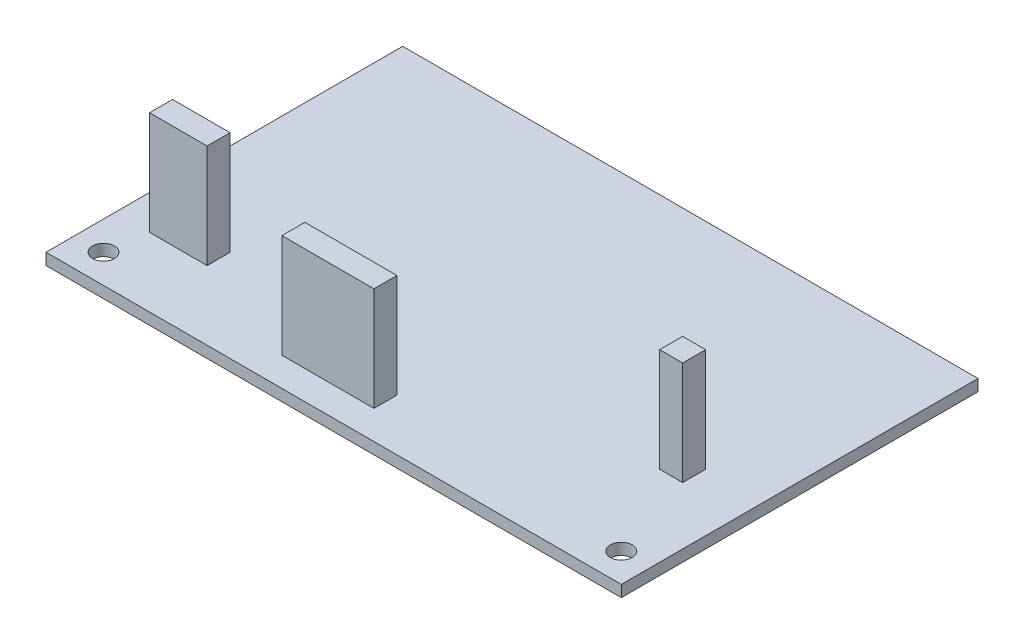
ISO-10303-21;
HEADER;
FILE_DESCRIPTION(('STEP AP214'),'2;1');
FILE_NAME('part.step','',(''),(''),'','','');
FILE_SCHEMA(('AUTOMOTIVE_DESIGN { 1 0 10303 214 1 1 1 1 }'));
ENDSEC;
DATA;
#1=APPLICATION_CONTEXT('core data for automotive mechanical design processes');
#2=APPLICATION_PROTOCOL_DEFINITION('international standard','automotive_design',2000,#1);
#3=PRODUCT_CONTEXT('',#1,'mechanical');
#4=PRODUCT('Part','Part','',(#3));
#5=PRODUCT_RELATED_PRODUCT_CATEGORY('part','',(#4));
#6=PRODUCT_DEFINITION_FORMATION('','',#4);
#7=PRODUCT_DEFINITION_CONTEXT('part definition',#1,'design');
#8=PRODUCT_DEFINITION('design','',#6,#7);
#9=PRODUCT_DEFINITION_SHAPE('','',#8);
#10=(LENGTH_UNIT() NAMED_UNIT(*) SI_UNIT(.MILLI.,.METRE.));
#11=(NAMED_UNIT(*) PLANE_ANGLE_UNIT() SI_UNIT($,.RADIAN.));
#12=(NAMED_UNIT(*) SI_UNIT($,.STERADIAN.) SOLID_ANGLE_UNIT());
#13=UNCERTAINTY_MEASURE_WITH_UNIT(LENGTH_MEASURE(1.E-05),#10,'distance_accuracy_value','');
#14=(GEOMETRIC_REPRESENTATION_CONTEXT(3) GLOBAL_UNCERTAINTY_ASSIGNED_CONTEXT((#13)) GLOBAL_UNIT_ASSIGNED_CONTEXT((#10,
#11,#12)) REPRESENTATION_CONTEXT('',''));
#15=CARTESIAN_POINT('',(0.,0.,0.));
#16=DIRECTION('',(0.,0.,1.));
#17=DIRECTION('',(1.,0.,0.));
#18=AXIS2_PLACEMENT_3D('',#15,#16,#17);
#19=CARTESIAN_POINT('',(3.52043596730246,-1.,0.));
#20=DIRECTION('',(-1.,0.,0.));
#21=DIRECTION('',(0.,0.,1.));
#22=AXIS2_PLACEMENT_3D('',#19,#20,#21);
#23=PLANE('',#22);
#24=DIRECTION('',(0.,1.,0.));
#25=VECTOR('',#24,1.);
#26=CARTESIAN_POINT('',(3.52043596730246,-1.,18.1212534059945));
#27=LINE('',#26,#25);
#28=CARTESIAN_POINT('',(3.52043596730246,0.,18.1212534059945));
#29=VERTEX_POINT('',#28);
#30=CARTESIAN_POINT('',(3.52043596730246,9.,18.1212534059945));
#31=VERTEX_POINT('',#30);
#32=EDGE_CURVE('E11',#29,#31,#27,.T.);
#33=ORIENTED_EDGE('',*,*,#32,.F.);
#34=DIRECTION('',(0.,0.,-1.));
#35=VECTOR('',#34,1.);
#36=CARTESIAN_POINT('',(3.52043596730246,0.,16.1212534059945));
#37=LINE('',#36,#35);
#38=CARTESIAN_POINT('',(3.52043596730246,0.,16.1212534059945));
#39=VERTEX_POINT('',#38);
#40=EDGE_CURVE('E256',#29,#39,#37,.T.);
#41=ORIENTED_EDGE('',*,*,#40,.T.);
#42=DIRECTION('',(0.,1.,0.));
#43=VECTOR('',#42,1.);
#44=CARTESIAN_POINT('',(3.52043596730246,-1.,16.1212534059945));
#45=LINE('',#44,#43);
#46=CARTESIAN_POINT('',(3.52043596730246,9.,16.1212534059945));
#47=VERTEX_POINT('',#46);
#48=EDGE_CURVE('E40',#39,#47,#45,.T.);
#49=ORIENTED_EDGE('',*,*,#48,.T.);
#50=DIRECTION('',(0.,0.,1.));
#51=VECTOR('',#50,1.);
#52=CARTESIAN_POINT('',(3.52043596730246,9.,0.));
#53=LINE('',#52,#51);
#54=EDGE_CURVE('E315',#47,#31,#53,.T.);
#55=ORIENTED_EDGE('',*,*,#54,.T.);
#56=EDGE_LOOP('',(#33,#41,#49,#55));
#57=FACE_BOUND('',#56,.T.);
#58=ADVANCED_FACE('F37',(#57),#23,.F.);
#59=CARTESIAN_POINT('',(0.,-1.,18.1212534059945));
#60=DIRECTION('',(0.,0.,1.));
#61=DIRECTION('',(1.,0.,0.));
#62=AXIS2_PLACEMENT_3D('',#59,#60,#61);
#63=PLANE('',#62);
#64=DIRECTION('',(1.,0.,0.));
#65=VECTOR('',#64,1.);
#66=CARTESIAN_POINT('',(-4.47956403269754,0.,18.1212534059945));
#67=LINE('',#66,#65);
#68=CARTESIAN_POINT('',(-4.47956403269754,0.,18.1212534059945));
#69=VERTEX_POINT('',#68);
#70=EDGE_CURVE('E253',#69,#29,#67,.T.);
#71=ORIENTED_EDGE('',*,*,#70,.T.);
#72=ORIENTED_EDGE('',*,*,#32,.T.);
#73=DIRECTION('',(1.,0.,0.));
#74=VECTOR('',#73,1.);
#75=CARTESIAN_POINT('',(0.,9.,18.1212534059945));
#76=LINE('',#75,#74);
#77=CARTESIAN_POINT('',(-4.47956403269754,9.,18.1212534059945));
#78=VERTEX_POINT('',#77);
#79=EDGE_CURVE('E335',#78,#31,#76,.T.);
#80=ORIENTED_EDGE('',*,*,#79,.F.);
#81=DIRECTION('',(0.,1.,0.));
#82=VECTOR('',#81,1.);
#83=CARTESIAN_POINT('',(-4.47956403269754,-1.,18.1212534059945));
#84=LINE('',#83,#82);
#85=EDGE_CURVE('E46',#69,#78,#84,.T.);
#86=ORIENTED_EDGE('',*,*,#85,.F.);
#87=EDGE_LOOP('',(#71,#72,#80,#86));
#88=FACE_BOUND('',#87,.T.);
#89=ADVANCED_FACE('F360',(#88),#63,.T.);
#90=CARTESIAN_POINT('',(-4.47956403269754,-1.,0.));
#91=DIRECTION('',(-1.,0.,0.));
#92=DIRECTION('',(0.,0.,1.));
#93=AXIS2_PLACEMENT_3D('',#90,#91,#92);
#94=PLANE('',#93);
#95=DIRECTION('',(0.,0.,1.));
#96=VECTOR('',#95,1.);
#97=CARTESIAN_POINT('',(-4.47956403269754,0.,16.1212534059945));
#98=LINE('',#97,#96);
#99=CARTESIAN_POINT('',(-4.47956403269754,0.,16.1212534059945));
#100=VERTEX_POINT('',#99);
#101=EDGE_CURVE('E54',#100,#69,#98,.T.);
#102=ORIENTED_EDGE('',*,*,#101,.T.);
#103=ORIENTED_EDGE('',*,*,#85,.T.);
#104=DIRECTION('',(0.,0.,1.));
#105=VECTOR('',#104,1.);
#106=CARTESIAN_POINT('',(-4.47956403269754,9.,0.));
#107=LINE('',#106,#105);
#108=CARTESIAN_POINT('',(-4.47956403269754,9.,16.1212534059945));
#109=VERTEX_POINT('',#108);
#110=EDGE_CURVE('E331',#109,#78,#107,.T.);
#111=ORIENTED_EDGE('',*,*,#110,.F.);
#112=DIRECTION('',(0.,1.,0.));
#113=VECTOR('',#112,1.);
#114=CARTESIAN_POINT('',(-4.47956403269754,-1.,16.1212534059945));
#115=LINE('',#114,#113);
#116=EDGE_CURVE('E339',#100,#109,#115,.T.);
#117=ORIENTED_EDGE('',*,*,#116,.F.);
#118=EDGE_LOOP('',(#102,#103,#111,#117));
#119=FACE_BOUND('',#118,.T.);
#120=ADVANCED_FACE('F353',(#119),#94,.T.);
#121=CARTESIAN_POINT('',(0.,-1.,16.1212534059945));
#122=DIRECTION('',(0.,0.,1.));
#123=DIRECTION('',(1.,0.,0.));
#124=AXIS2_PLACEMENT_3D('',#121,#122,#123);
#125=PLANE('',#124);
#126=ORIENTED_EDGE('',*,*,#48,.F.);
#127=DIRECTION('',(-1.,0.,0.));
#128=VECTOR('',#127,1.);
#129=CARTESIAN_POINT('',(-4.47956403269754,0.,16.1212534059945));
#130=LINE('',#129,#128);
#131=EDGE_CURVE('E260',#39,#100,#130,.T.);
#132=ORIENTED_EDGE('',*,*,#131,.T.);
#133=ORIENTED_EDGE('',*,*,#116,.T.);
#134=DIRECTION('',(1.,0.,0.));
#135=VECTOR('',#134,1.);
#136=CARTESIAN_POINT('',(0.,9.,16.1212534059945));
#137=LINE('',#136,#135);
#138=EDGE_CURVE('E327',#109,#47,#137,.T.);
#139=ORIENTED_EDGE('',*,*,#138,.T.);
#140=EDGE_LOOP('',(#126,#132,#133,#139));
#141=FACE_BOUND('',#140,.T.);
#142=ADVANCED_FACE('F351',(#141),#125,.F.);
#143=CARTESIAN_POINT('',(0.,9.,0.));
#144=DIRECTION('',(0.,1.,0.));
#145=DIRECTION('',(0.,0.,1.));
#146=AXIS2_PLACEMENT_3D('',#143,#144,#145);
#147=PLANE('',#146);
#148=ORIENTED_EDGE('',*,*,#54,.F.);
#149=ORIENTED_EDGE('',*,*,#138,.F.);
#150=ORIENTED_EDGE('',*,*,#110,.T.);
#151=ORIENTED_EDGE('',*,*,#79,.T.);
#152=EDGE_LOOP('',(#148,#149,#150,#151));
#153=FACE_BOUND('',#152,.T.);
#154=ADVANCED_FACE('F350',(#153),#147,.T.);
#155=CARTESIAN_POINT('',(-22.4795640326975,-1.,-10.3787465940055));
#156=DIRECTION('',(-1.,0.,0.));
#157=DIRECTION('',(0.,0.,1.));
#158=AXIS2_PLACEMENT_3D('',#155,#156,#157);
#159=PLANE('',#158);
#160=DIRECTION('',(0.,0.,1.));
#161=VECTOR('',#160,1.);
#162=CARTESIAN_POINT('',(-22.4795640326975,0.,-10.3787465940055));
#163=LINE('',#162,#161);
#164=CARTESIAN_POINT('',(-22.4795640326975,0.,-10.3787465940055));
#165=VERTEX_POINT('',#164);
#166=CARTESIAN_POINT('',(-22.4795640326975,0.,20.6212534059945));
#167=VERTEX_POINT('',#166);
#168=EDGE_CURVE('E276',#165,#167,#163,.T.);
#169=ORIENTED_EDGE('',*,*,#168,.F.);
#170=DIRECTION('',(0.,1.,0.));
#171=VECTOR('',#170,1.);
#172=CARTESIAN_POINT('',(-22.4795640326975,-1.,-10.3787465940055));
#173=LINE('',#172,#171);
#174=CARTESIAN_POINT('',(-22.4795640326975,-1.,-10.3787465940055));
#175=VERTEX_POINT('',#174);
#176=EDGE_CURVE('E312',#175,#165,#173,.T.);
#177=ORIENTED_EDGE('',*,*,#176,.F.);
#178=DIRECTION('',(0.,0.,1.));
#179=VECTOR('',#178,1.);
#180=CARTESIAN_POINT('',(-22.4795640326975,-1.,-10.3787465940055));
#181=LINE('',#180,#179);
#182=CARTESIAN_POINT('',(-22.4795640326975,-1.,20.6212534059945));
#183=VERTEX_POINT('',#182);
#184=EDGE_CURVE('E280',#175,#183,#181,.T.);
#185=ORIENTED_EDGE('',*,*,#184,.T.);
#186=DIRECTION('',(0.,1.,0.));
#187=VECTOR('',#186,1.);
#188=CARTESIAN_POINT('',(-22.4795640326975,-1.,20.6212534059945));
#189=LINE('',#188,#187);
#190=EDGE_CURVE('E297',#183,#167,#189,.T.);
#191=ORIENTED_EDGE('',*,*,#190,.T.);
#192=EDGE_LOOP('',(#169,#177,#185,#191));
#193=FACE_BOUND('',#192,.T.);
#194=ADVANCED_FACE('F358',(#193),#159,.T.);
#195=CARTESIAN_POINT('',(-22.4795640326975,-1.,-10.3787465940055));
#196=DIRECTION('',(0.,0.,-1.));
#197=DIRECTION('',(-1.,0.,0.));
#198=AXIS2_PLACEMENT_3D('',#195,#196,#197);
#199=PLANE('',#198);
#200=DIRECTION('',(-1.,0.,0.));
#201=VECTOR('',#200,1.);
#202=CARTESIAN_POINT('',(-22.4795640326975,0.,-10.3787465940055));
#203=LINE('',#202,#201);
#204=CARTESIAN_POINT('',(27.5204359673025,0.,-10.3787465940055));
#205=VERTEX_POINT('',#204);
#206=EDGE_CURVE('E285',#205,#165,#203,.T.);
#207=ORIENTED_EDGE('',*,*,#206,.F.);
#208=DIRECTION('',(0.,1.,0.));
#209=VECTOR('',#208,1.);
#210=CARTESIAN_POINT('',(27.5204359673025,-1.,-10.3787465940055));
#211=LINE('',#210,#209);
#212=CARTESIAN_POINT('',(27.5204359673025,-1.,-10.3787465940055));
#213=VERTEX_POINT('',#212);
#214=EDGE_CURVE('E316',#213,#205,#211,.T.);
#215=ORIENTED_EDGE('',*,*,#214,.F.);
#216=DIRECTION('',(-1.,0.,0.));
#217=VECTOR('',#216,1.);
#218=CARTESIAN_POINT('',(-22.4795640326975,-1.,-10.3787465940055));
#219=LINE('',#218,#217);
#220=EDGE_CURVE('E293',#213,#175,#219,.T.);
#221=ORIENTED_EDGE('',*,*,#220,.T.);
#222=ORIENTED_EDGE('',*,*,#176,.T.);
#223=EDGE_LOOP('',(#207,#215,#221,#222));
#224=FACE_BOUND('',#223,.T.);
#225=ADVANCED_FACE('F379',(#224),#199,.T.);
#226=CARTESIAN_POINT('',(27.5204359673025,-1.,-10.3787465940055));
#227=DIRECTION('',(1.,0.,0.));
#228=DIRECTION('',(0.,0.,-1.));
#229=AXIS2_PLACEMENT_3D('',#226,#227,#228);
#230=PLANE('',#229);
#231=DIRECTION('',(0.,0.,-1.));
#232=VECTOR('',#231,1.);
#233=CARTESIAN_POINT('',(27.5204359673025,0.,-10.3787465940055));
#234=LINE('',#233,#232);
#235=CARTESIAN_POINT('',(27.5204359673025,0.,20.6212534059945));
#236=VERTEX_POINT('',#235);
#237=EDGE_CURVE('E305',#236,#205,#234,.T.);
#238=ORIENTED_EDGE('',*,*,#237,.F.);
#239=DIRECTION('',(0.,1.,0.));
#240=VECTOR('',#239,1.);
#241=CARTESIAN_POINT('',(27.5204359673025,-1.,20.6212534059945));
#242=LINE('',#241,#240);
#243=CARTESIAN_POINT('',(27.5204359673025,-1.,20.6212534059945));
#244=VERTEX_POINT('',#243);
#245=EDGE_CURVE('E319',#244,#236,#242,.T.);
#246=ORIENTED_EDGE('',*,*,#245,.F.);
#247=DIRECTION('',(0.,0.,-1.));
#248=VECTOR('',#247,1.);
#249=CARTESIAN_POINT('',(27.5204359673025,-1.,-10.3787465940055));
#250=LINE('',#249,#248);
#251=EDGE_CURVE('E289',#244,#213,#250,.T.);
#252=ORIENTED_EDGE('',*,*,#251,.T.);
#253=ORIENTED_EDGE('',*,*,#214,.T.);
#254=EDGE_LOOP('',(#238,#246,#252,#253));
#255=FACE_BOUND('',#254,.T.);
#256=ADVANCED_FACE('F385',(#255),#230,.T.);
#257=CARTESIAN_POINT('',(-22.4795640326975,-1.,20.6212534059945));
#258=DIRECTION('',(0.,0.,1.));
#259=DIRECTION('',(1.,0.,0.));
#260=AXIS2_PLACEMENT_3D('',#257,#258,#259);
#261=PLANE('',#260);
#262=DIRECTION('',(1.,0.,0.));
#263=VECTOR('',#262,1.);
#264=CARTESIAN_POINT('',(-22.4795640326975,0.,20.6212534059945));
#265=LINE('',#264,#263);
#266=EDGE_CURVE('E301',#167,#236,#265,.T.);
#267=ORIENTED_EDGE('',*,*,#266,.F.);
#268=ORIENTED_EDGE('',*,*,#190,.F.);
#269=DIRECTION('',(1.,0.,0.));
#270=VECTOR('',#269,1.);
#271=CARTESIAN_POINT('',(-22.4795640326975,-1.,20.6212534059945));
#272=LINE('',#271,#270);
#273=EDGE_CURVE('E284',#183,#244,#272,.T.);
#274=ORIENTED_EDGE('',*,*,#273,.T.);
#275=ORIENTED_EDGE('',*,*,#245,.T.);
#276=EDGE_LOOP('',(#267,#268,#274,#275));
#277=FACE_BOUND('',#276,.T.);
#278=ADVANCED_FACE('F381',(#277),#261,.T.);
#279=CARTESIAN_POINT('',(0.,0.,0.));
#280=DIRECTION('',(0.,1.,0.));
#281=DIRECTION('',(0.,0.,1.));
#282=AXIS2_PLACEMENT_3D('',#279,#280,#281);
#283=PLANE('',#282);
#284=DIRECTION('',(0.,0.,1.));
#285=VECTOR('',#284,1.);
#286=CARTESIAN_POINT('',(20.5204359673025,0.,8.28610354223433));
#287=LINE('',#286,#285);
#288=CARTESIAN_POINT('',(20.5204359673025,0.,8.28610354223433));
#289=VERTEX_POINT('',#288);
#290=CARTESIAN_POINT('',(20.5204359673025,0.,10.2861035422343));
#291=VERTEX_POINT('',#290);
#292=EDGE_CURVE('E214',#289,#291,#287,.T.);
#293=ORIENTED_EDGE('',*,*,#292,.F.);
#294=DIRECTION('',(-1.,0.,0.));
#295=VECTOR('',#294,1.);
#296=CARTESIAN_POINT('',(20.5204359673025,0.,8.28610354223433));
#297=LINE('',#296,#295);
#298=CARTESIAN_POINT('',(22.5204359673025,0.,8.28610354223433));
#299=VERTEX_POINT('',#298);
#300=EDGE_CURVE('E232',#299,#289,#297,.T.);
#301=ORIENTED_EDGE('',*,*,#300,.F.);
#302=DIRECTION('',(0.,0.,-1.));
#303=VECTOR('',#302,1.);
#304=CARTESIAN_POINT('',(22.5204359673025,0.,8.28610354223433));
#305=LINE('',#304,#303);
#306=CARTESIAN_POINT('',(22.5204359673025,0.,10.2861035422343));
#307=VERTEX_POINT('',#306);
#308=EDGE_CURVE('E158',#307,#299,#305,.T.);
#309=ORIENTED_EDGE('',*,*,#308,.F.);
#310=DIRECTION('',(1.,0.,0.));
#311=VECTOR('',#310,1.);
#312=CARTESIAN_POINT('',(20.5204359673025,0.,10.2861035422343));
#313=LINE('',#312,#311);
#314=EDGE_CURVE('E226',#291,#307,#313,.T.);
#315=ORIENTED_EDGE('',*,*,#314,.F.);
#316=EDGE_LOOP('',(#293,#301,#309,#315));
#317=FACE_BOUND('',#316,.T.);
#318=DIRECTION('',(0.,0.,1.));
#319=VECTOR('',#318,1.);
#320=CARTESIAN_POINT('',(-19.4795640326975,0.,12.6212534059945));
#321=LINE('',#320,#319);
#322=CARTESIAN_POINT('',(-19.4795640326975,0.,12.6212534059945));
#323=VERTEX_POINT('',#322);
#324=CARTESIAN_POINT('',(-19.4795640326975,0.,14.6212534059945));
#325=VERTEX_POINT('',#324);
#326=EDGE_CURVE('E235',#323,#325,#321,.T.);
#327=ORIENTED_EDGE('',*,*,#326,.F.);
#328=DIRECTION('',(-1.,0.,0.));
#329=VECTOR('',#328,1.);
#330=CARTESIAN_POINT('',(-19.4795640326975,0.,12.6212534059945));
#331=LINE('',#330,#329);
#332=CARTESIAN_POINT('',(-14.4795640326975,0.,12.6212534059945));
#333=VERTEX_POINT('',#332);
#334=EDGE_CURVE('E247',#333,#323,#331,.T.);
#335=ORIENTED_EDGE('',*,*,#334,.F.);
#336=DIRECTION('',(0.,0.,-1.));
#337=VECTOR('',#336,1.);
#338=CARTESIAN_POINT('',(-14.4795640326975,0.,12.6212534059945));
#339=LINE('',#338,#337);
#340=CARTESIAN_POINT('',(-14.4795640326975,0.,14.6212534059945));
#341=VERTEX_POINT('',#340);
#342=EDGE_CURVE('E243',#341,#333,#339,.T.);
#343=ORIENTED_EDGE('',*,*,#342,.F.);
#344=DIRECTION('',(1.,0.,0.));
#345=VECTOR('',#344,1.);
#346=CARTESIAN_POINT('',(-19.4795640326975,0.,14.6212534059945));
#347=LINE('',#346,#345);
#348=EDGE_CURVE('E239',#325,#341,#347,.T.);
#349=ORIENTED_EDGE('',*,*,#348,.F.);
#350=EDGE_LOOP('',(#327,#335,#343,#349));
#351=FACE_BOUND('',#350,.T.);
#352=ORIENTED_EDGE('',*,*,#101,.F.);
#353=ORIENTED_EDGE('',*,*,#131,.F.);
#354=ORIENTED_EDGE('',*,*,#40,.F.);
#355=ORIENTED_EDGE('',*,*,#70,.F.);
#356=EDGE_LOOP('',(#352,#353,#354,#355));
#357=FACE_BOUND('',#356,.T.);
#358=CARTESIAN_POINT('',(-19.9795640326975,0.,18.1212534059945));
#359=DIRECTION('',(0.,1.,0.));
#360=DIRECTION('',(0.,0.,1.));
#361=AXIS2_PLACEMENT_3D('',#358,#359,#360);
#362=CIRCLE('',#361,0.950000000000001);
#363=CARTESIAN_POINT('',(-19.9795640326975,0.,19.0712534059945));
#364=VERTEX_POINT('',#363);
#365=EDGE_CURVE('E263',#364,#364,#362,.T.);
#366=ORIENTED_EDGE('',*,*,#365,.F.);
#367=EDGE_LOOP('',(#366));
#368=FACE_BOUND('',#367,.T.);
#369=CARTESIAN_POINT('',(25.0204359673025,0.,18.1212534059945));
#370=DIRECTION('',(0.,1.,0.));
#371=DIRECTION('',(0.,0.,1.));
#372=AXIS2_PLACEMENT_3D('',#369,#370,#371);
#373=CIRCLE('',#372,0.950000000000001);
#374=CARTESIAN_POINT('',(25.0204359673025,0.,19.0712534059945));
#375=VERTEX_POINT('',#374);
#376=EDGE_CURVE('E268',#375,#375,#373,.T.);
#377=ORIENTED_EDGE('',*,*,#376,.F.);
#378=EDGE_LOOP('',(#377));
#379=FACE_BOUND('',#378,.T.);
#380=ORIENTED_EDGE('',*,*,#168,.T.);
#381=ORIENTED_EDGE('',*,*,#266,.T.);
#382=ORIENTED_EDGE('',*,*,#237,.T.);
#383=ORIENTED_EDGE('',*,*,#206,.T.);
#384=EDGE_LOOP('',(#380,#381,#382,#383));
#385=FACE_BOUND('',#384,.T.);
#386=ADVANCED_FACE('F384',(#317,#351,#357,#368,#379,#385),#283,.T.);
#387=CARTESIAN_POINT('',(25.0204359673025,-1.,18.1212534059945));
#388=DIRECTION('',(0.,1.,0.));
#389=DIRECTION('',(0.,0.,1.));
#390=AXIS2_PLACEMENT_3D('',#387,#388,#389);
#391=CYLINDRICAL_SURFACE('',#390,0.950000000000001);
#392=CARTESIAN_POINT('',(25.0204359673025,-1.,18.1212534059945));
#393=DIRECTION('',(0.,1.,0.));
#394=DIRECTION('',(0.,0.,1.));
#395=AXIS2_PLACEMENT_3D('',#392,#393,#394);
#396=CIRCLE('',#395,0.950000000000001);
#397=CARTESIAN_POINT('',(25.0204359673025,-1.,19.0712534059945));
#398=VERTEX_POINT('',#397);
#399=EDGE_CURVE('E272',#398,#398,#396,.T.);
#400=ORIENTED_EDGE('',*,*,#399,.F.);
#401=EDGE_LOOP('',(#400));
#402=FACE_BOUND('',#401,.T.);
#403=ORIENTED_EDGE('',*,*,#376,.T.);
#404=EDGE_LOOP('',(#403));
#405=FACE_BOUND('',#404,.T.);
#406=ADVANCED_FACE('F395',(#402,#405),#391,.F.);
#407=CARTESIAN_POINT('',(-19.9795640326975,-1.,18.1212534059945));
#408=DIRECTION('',(0.,1.,0.));
#409=DIRECTION('',(0.,0.,1.));
#410=AXIS2_PLACEMENT_3D('',#407,#408,#409);
#411=CYLINDRICAL_SURFACE('',#410,0.950000000000001);
#412=CARTESIAN_POINT('',(-19.9795640326975,-1.,18.1212534059945));
#413=DIRECTION('',(0.,1.,0.));
#414=DIRECTION('',(0.,0.,1.));
#415=AXIS2_PLACEMENT_3D('',#412,#413,#414);
#416=CIRCLE('',#415,0.950000000000001);
#417=CARTESIAN_POINT('',(-19.9795640326975,-1.,19.0712534059945));
#418=VERTEX_POINT('',#417);
#419=EDGE_CURVE('E264',#418,#418,#416,.T.);
#420=ORIENTED_EDGE('',*,*,#419,.F.);
#421=EDGE_LOOP('',(#420));
#422=FACE_BOUND('',#421,.T.);
#423=ORIENTED_EDGE('',*,*,#365,.T.);
#424=EDGE_LOOP('',(#423));
#425=FACE_BOUND('',#424,.T.);
#426=ADVANCED_FACE('F374',(#422,#425),#411,.F.);
#427=CARTESIAN_POINT('',(0.,-1.,0.));
#428=DIRECTION('',(0.,1.,0.));
#429=DIRECTION('',(0.,0.,1.));
#430=AXIS2_PLACEMENT_3D('',#427,#428,#429);
#431=PLANE('',#430);
#432=ORIENTED_EDGE('',*,*,#419,.T.);
#433=EDGE_LOOP('',(#432));
#434=FACE_BOUND('',#433,.T.);
#435=ORIENTED_EDGE('',*,*,#399,.T.);
#436=EDGE_LOOP('',(#435));
#437=FACE_BOUND('',#436,.T.);
#438=ORIENTED_EDGE('',*,*,#184,.F.);
#439=ORIENTED_EDGE('',*,*,#220,.F.);
#440=ORIENTED_EDGE('',*,*,#251,.F.);
#441=ORIENTED_EDGE('',*,*,#273,.F.);
#442=EDGE_LOOP('',(#438,#439,#440,#441));
#443=FACE_BOUND('',#442,.T.);
#444=ADVANCED_FACE('F371',(#434,#437,#443),#431,.F.);
#445=CARTESIAN_POINT('',(-14.4795640326975,-1.,0.));
#446=DIRECTION('',(-1.,0.,0.));
#447=DIRECTION('',(0.,0.,1.));
#448=AXIS2_PLACEMENT_3D('',#445,#446,#447);
#449=PLANE('',#448);
#450=ORIENTED_EDGE('',*,*,#342,.T.);
#451=DIRECTION('',(0.,1.,0.));
#452=VECTOR('',#451,1.);
#453=CARTESIAN_POINT('',(-14.4795640326975,-1.,12.6212534059945));
#454=LINE('',#453,#452);
#455=CARTESIAN_POINT('',(-14.4795640326975,9.,12.6212534059945));
#456=VERTEX_POINT('',#455);
#457=EDGE_CURVE('E210',#333,#456,#454,.T.);
#458=ORIENTED_EDGE('',*,*,#457,.T.);
#459=DIRECTION('',(0.,0.,1.));
#460=VECTOR('',#459,1.);
#461=CARTESIAN_POINT('',(-14.4795640326975,9.,0.));
#462=LINE('',#461,#460);
#463=CARTESIAN_POINT('',(-14.4795640326975,9.,14.6212534059945));
#464=VERTEX_POINT('',#463);
#465=EDGE_CURVE('E189',#456,#464,#462,.T.);
#466=ORIENTED_EDGE('',*,*,#465,.T.);
#467=DIRECTION('',(0.,1.,0.));
#468=VECTOR('',#467,1.);
#469=CARTESIAN_POINT('',(-14.4795640326975,-1.,14.6212534059945));
#470=LINE('',#469,#468);
#471=EDGE_CURVE('E211',#341,#464,#470,.T.);
#472=ORIENTED_EDGE('',*,*,#471,.F.);
#473=EDGE_LOOP('',(#450,#458,#466,#472));
#474=FACE_BOUND('',#473,.T.);
#475=ADVANCED_FACE('F373',(#474),#449,.F.);
#476=CARTESIAN_POINT('',(0.,-1.,14.6212534059945));
#477=DIRECTION('',(0.,0.,1.));
#478=DIRECTION('',(1.,0.,0.));
#479=AXIS2_PLACEMENT_3D('',#476,#477,#478);
#480=PLANE('',#479);
#481=DIRECTION('',(0.,1.,0.));
#482=VECTOR('',#481,1.);
#483=CARTESIAN_POINT('',(-19.4795640326975,-1.,14.6212534059945));
#484=LINE('',#483,#482);
#485=CARTESIAN_POINT('',(-19.4795640326975,9.,14.6212534059945));
#486=VERTEX_POINT('',#485);
#487=EDGE_CURVE('E215',#325,#486,#484,.T.);
#488=ORIENTED_EDGE('',*,*,#487,.F.);
#489=ORIENTED_EDGE('',*,*,#348,.T.);
#490=ORIENTED_EDGE('',*,*,#471,.T.);
#491=DIRECTION('',(1.,0.,0.));
#492=VECTOR('',#491,1.);
#493=CARTESIAN_POINT('',(0.,9.,14.6212534059945));
#494=LINE('',#493,#492);
#495=EDGE_CURVE('E206',#486,#464,#494,.T.);
#496=ORIENTED_EDGE('',*,*,#495,.F.);
#497=EDGE_LOOP('',(#488,#489,#490,#496));
#498=FACE_BOUND('',#497,.T.);
#499=ADVANCED_FACE('F405',(#498),#480,.T.);
#500=CARTESIAN_POINT('',(-19.4795640326975,-1.,0.));
#501=DIRECTION('',(-1.,0.,0.));
#502=DIRECTION('',(0.,0.,1.));
#503=AXIS2_PLACEMENT_3D('',#500,#501,#502);
#504=PLANE('',#503);
#505=DIRECTION('',(0.,1.,0.));
#506=VECTOR('',#505,1.);
#507=CARTESIAN_POINT('',(-19.4795640326975,-1.,12.6212534059945));
#508=LINE('',#507,#506);
#509=CARTESIAN_POINT('',(-19.4795640326975,9.,12.6212534059945));
#510=VERTEX_POINT('',#509);
#511=EDGE_CURVE('E218',#323,#510,#508,.T.);
#512=ORIENTED_EDGE('',*,*,#511,.F.);
#513=ORIENTED_EDGE('',*,*,#326,.T.);
#514=ORIENTED_EDGE('',*,*,#487,.T.);
#515=DIRECTION('',(0.,0.,1.));
#516=VECTOR('',#515,1.);
#517=CARTESIAN_POINT('',(-19.4795640326975,9.,0.));
#518=LINE('',#517,#516);
#519=EDGE_CURVE('E202',#510,#486,#518,.T.);
#520=ORIENTED_EDGE('',*,*,#519,.F.);
#521=EDGE_LOOP('',(#512,#513,#514,#520));
#522=FACE_BOUND('',#521,.T.);
#523=ADVANCED_FACE('F411',(#522),#504,.T.);
#524=CARTESIAN_POINT('',(0.,-1.,12.6212534059945));
#525=DIRECTION('',(0.,0.,1.));
#526=DIRECTION('',(1.,0.,0.));
#527=AXIS2_PLACEMENT_3D('',#524,#525,#526);
#528=PLANE('',#527);
#529=ORIENTED_EDGE('',*,*,#334,.T.);
#530=ORIENTED_EDGE('',*,*,#511,.T.);
#531=DIRECTION('',(1.,0.,0.));
#532=VECTOR('',#531,1.);
#533=CARTESIAN_POINT('',(0.,9.,12.6212534059945));
#534=LINE('',#533,#532);
#535=EDGE_CURVE('E198',#510,#456,#534,.T.);
#536=ORIENTED_EDGE('',*,*,#535,.T.);
#537=ORIENTED_EDGE('',*,*,#457,.F.);
#538=EDGE_LOOP('',(#529,#530,#536,#537));
#539=FACE_BOUND('',#538,.T.);
#540=ADVANCED_FACE('F407',(#539),#528,.F.);
#541=CARTESIAN_POINT('',(0.,9.,0.));
#542=DIRECTION('',(0.,1.,0.));
#543=DIRECTION('',(0.,0.,1.));
#544=AXIS2_PLACEMENT_3D('',#541,#542,#543);
#545=PLANE('',#544);
#546=ORIENTED_EDGE('',*,*,#465,.F.);
#547=ORIENTED_EDGE('',*,*,#535,.F.);
#548=ORIENTED_EDGE('',*,*,#519,.T.);
#549=ORIENTED_EDGE('',*,*,#495,.T.);
#550=EDGE_LOOP('',(#546,#547,#548,#549));
#551=FACE_BOUND('',#550,.T.);
#552=ADVANCED_FACE('F410',(#551),#545,.T.);
#553=CARTESIAN_POINT('',(22.5204359673025,-1.,0.));
#554=DIRECTION('',(-1.,0.,0.));
#555=DIRECTION('',(0.,0.,1.));
#556=AXIS2_PLACEMENT_3D('',#553,#554,#555);
#557=PLANE('',#556);
#558=ORIENTED_EDGE('',*,*,#308,.T.);
#559=DIRECTION('',(0.,1.,0.));
#560=VECTOR('',#559,1.);
#561=CARTESIAN_POINT('',(22.5204359673025,-1.,8.28610354223433));
#562=LINE('',#561,#560);
#563=CARTESIAN_POINT('',(22.5204359673025,9.,8.28610354223433));
#564=VERTEX_POINT('',#563);
#565=EDGE_CURVE('E153',#299,#564,#562,.T.);
#566=ORIENTED_EDGE('',*,*,#565,.T.);
#567=DIRECTION('',(0.,0.,1.));
#568=VECTOR('',#567,1.);
#569=CARTESIAN_POINT('',(22.5204359673025,9.,0.));
#570=LINE('',#569,#568);
#571=CARTESIAN_POINT('',(22.5204359673025,9.,10.2861035422343));
#572=VERTEX_POINT('',#571);
#573=EDGE_CURVE('E157',#564,#572,#570,.T.);
#574=ORIENTED_EDGE('',*,*,#573,.T.);
#575=DIRECTION('',(0.,1.,0.));
#576=VECTOR('',#575,1.);
#577=CARTESIAN_POINT('',(22.5204359673025,-1.,10.2861035422343));
#578=LINE('',#577,#576);
#579=EDGE_CURVE('E186',#307,#572,#578,.T.);
#580=ORIENTED_EDGE('',*,*,#579,.F.);
#581=EDGE_LOOP('',(#558,#566,#574,#580));
#582=FACE_BOUND('',#581,.T.);
#583=ADVANCED_FACE('F155',(#582),#557,.F.);
#584=CARTESIAN_POINT('',(0.,-1.,10.2861035422343));
#585=DIRECTION('',(0.,0.,1.));
#586=DIRECTION('',(1.,0.,0.));
#587=AXIS2_PLACEMENT_3D('',#584,#585,#586);
#588=PLANE('',#587);
#589=DIRECTION('',(0.,1.,0.));
#590=VECTOR('',#589,1.);
#591=CARTESIAN_POINT('',(20.5204359673025,-1.,10.2861035422343));
#592=LINE('',#591,#590);
#593=CARTESIAN_POINT('',(20.5204359673025,9.,10.2861035422343));
#594=VERTEX_POINT('',#593);
#595=EDGE_CURVE('E190',#291,#594,#592,.T.);
#596=ORIENTED_EDGE('',*,*,#595,.F.);
#597=ORIENTED_EDGE('',*,*,#314,.T.);
#598=ORIENTED_EDGE('',*,*,#579,.T.);
#599=DIRECTION('',(1.,0.,0.));
#600=VECTOR('',#599,1.);
#601=CARTESIAN_POINT('',(0.,9.,10.2861035422343));
#602=LINE('',#601,#600);
#603=EDGE_CURVE('E164',#594,#572,#602,.T.);
#604=ORIENTED_EDGE('',*,*,#603,.F.);
#605=EDGE_LOOP('',(#596,#597,#598,#604));
#606=FACE_BOUND('',#605,.T.);
#607=ADVANCED_FACE('F424',(#606),#588,.T.);
#608=CARTESIAN_POINT('',(20.5204359673025,-1.,0.));
#609=DIRECTION('',(-1.,0.,0.));
#610=DIRECTION('',(0.,0.,1.));
#611=AXIS2_PLACEMENT_3D('',#608,#609,#610);
#612=PLANE('',#611);
#613=DIRECTION('',(0.,1.,0.));
#614=VECTOR('',#613,1.);
#615=CARTESIAN_POINT('',(20.5204359673025,-1.,8.28610354223433));
#616=LINE('',#615,#614);
#617=CARTESIAN_POINT('',(20.5204359673025,9.,8.28610354223433));
#618=VERTEX_POINT('',#617);
#619=EDGE_CURVE('E163',#289,#618,#616,.T.);
#620=ORIENTED_EDGE('',*,*,#619,.F.);
#621=ORIENTED_EDGE('',*,*,#292,.T.);
#622=ORIENTED_EDGE('',*,*,#595,.T.);
#623=DIRECTION('',(0.,0.,1.));
#624=VECTOR('',#623,1.);
#625=CARTESIAN_POINT('',(20.5204359673025,9.,0.));
#626=LINE('',#625,#624);
#627=EDGE_CURVE('E179',#618,#594,#626,.T.);
#628=ORIENTED_EDGE('',*,*,#627,.F.);
#629=EDGE_LOOP('',(#620,#621,#622,#628));
#630=FACE_BOUND('',#629,.T.);
#631=ADVANCED_FACE('F427',(#630),#612,.T.);
#632=CARTESIAN_POINT('',(0.,-1.,8.28610354223433));
#633=DIRECTION('',(0.,0.,1.));
#634=DIRECTION('',(1.,0.,0.));
#635=AXIS2_PLACEMENT_3D('',#632,#633,#634);
#636=PLANE('',#635);
#637=ORIENTED_EDGE('',*,*,#300,.T.);
#638=ORIENTED_EDGE('',*,*,#619,.T.);
#639=DIRECTION('',(1.,0.,0.));
#640=VECTOR('',#639,1.);
#641=CARTESIAN_POINT('',(0.,9.,8.28610354223433));
#642=LINE('',#641,#640);
#643=EDGE_CURVE('E171',#618,#564,#642,.T.);
#644=ORIENTED_EDGE('',*,*,#643,.T.);
#645=ORIENTED_EDGE('',*,*,#565,.F.);
#646=EDGE_LOOP('',(#637,#638,#644,#645));
#647=FACE_BOUND('',#646,.T.);
#648=ADVANCED_FACE('F175',(#647),#636,.F.);
#649=CARTESIAN_POINT('',(0.,9.,0.));
#650=DIRECTION('',(0.,1.,0.));
#651=DIRECTION('',(0.,0.,1.));
#652=AXIS2_PLACEMENT_3D('',#649,#650,#651);
#653=PLANE('',#652);
#654=ORIENTED_EDGE('',*,*,#573,.F.);
#655=ORIENTED_EDGE('',*,*,#643,.F.);
#656=ORIENTED_EDGE('',*,*,#627,.T.);
#657=ORIENTED_EDGE('',*,*,#603,.T.);
#658=EDGE_LOOP('',(#654,#655,#656,#657));
#659=FACE_BOUND('',#658,.T.);
#660=ADVANCED_FACE('F169',(#659),#653,.T.);
#661=CLOSED_SHELL('',(#58,#89,#120,#142,#154,#194,#225,#256,#278,#386,#406,#426,#444,#475,#499,
#523,#540,#552,#583,#607,#631,#648,#660));
#662=MANIFOLD_SOLID_BREP('B2',#661);
#663=ADVANCED_BREP_SHAPE_REPRESENTATION('',(#18,#662),#14);
#664=SHAPE_DEFINITION_REPRESENTATION(#9,#663);
ENDSEC;
END-ISO-10303-21;
